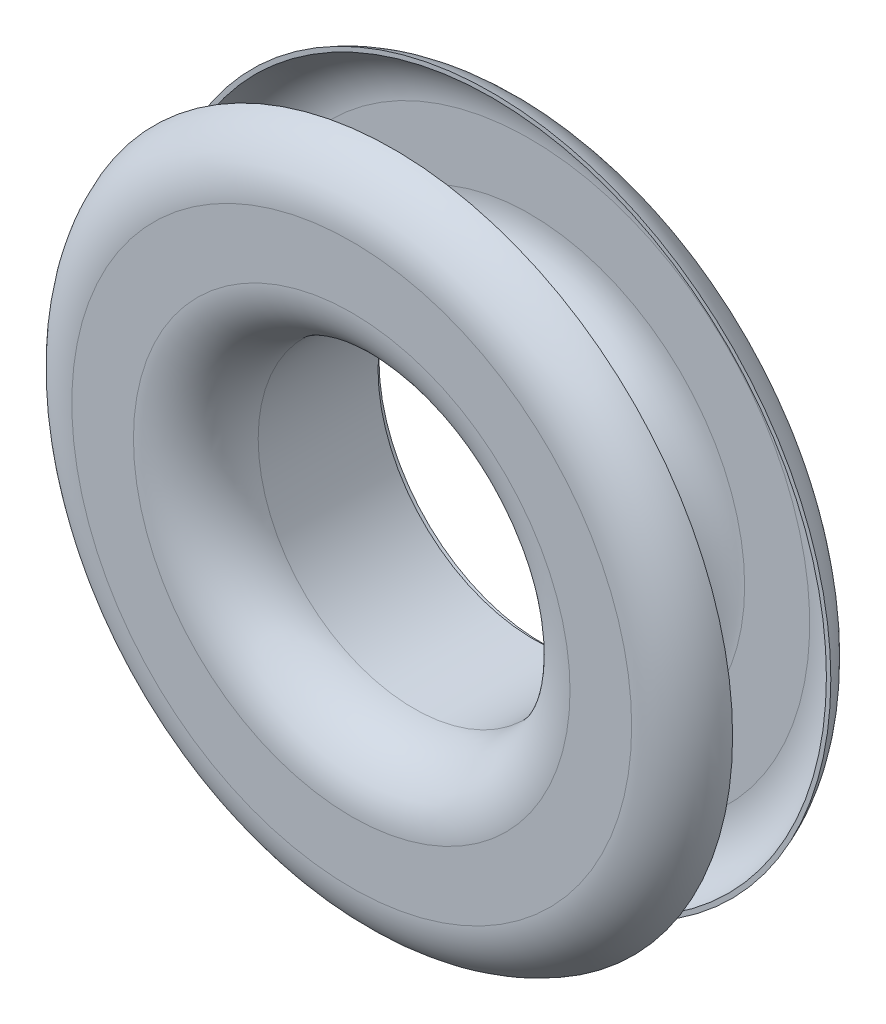
ISO-10303-21;
HEADER;
FILE_DESCRIPTION(('STEP AP214'),'2;1');
FILE_NAME('part.step','',(''),(''),'','','');
FILE_SCHEMA(('AUTOMOTIVE_DESIGN { 1 0 10303 214 1 1 1 1 }'));
ENDSEC;
DATA;
#1=APPLICATION_CONTEXT('core data for automotive mechanical design processes');
#2=APPLICATION_PROTOCOL_DEFINITION('international standard','automotive_design',2000,#1);
#3=PRODUCT_CONTEXT('',#1,'mechanical');
#4=PRODUCT('Part','Part','',(#3));
#5=PRODUCT_RELATED_PRODUCT_CATEGORY('part','',(#4));
#6=PRODUCT_DEFINITION_FORMATION('','',#4);
#7=PRODUCT_DEFINITION_CONTEXT('part definition',#1,'design');
#8=PRODUCT_DEFINITION('design','',#6,#7);
#9=PRODUCT_DEFINITION_SHAPE('','',#8);
#10=(LENGTH_UNIT() NAMED_UNIT(*) SI_UNIT(.MILLI.,.METRE.));
#11=(NAMED_UNIT(*) PLANE_ANGLE_UNIT() SI_UNIT($,.RADIAN.));
#12=(NAMED_UNIT(*) SI_UNIT($,.STERADIAN.) SOLID_ANGLE_UNIT());
#13=UNCERTAINTY_MEASURE_WITH_UNIT(LENGTH_MEASURE(1.E-05),#10,'distance_accuracy_value','');
#14=(GEOMETRIC_REPRESENTATION_CONTEXT(3) GLOBAL_UNCERTAINTY_ASSIGNED_CONTEXT((#13)) GLOBAL_UNIT_ASSIGNED_CONTEXT((#10,
#11,#12)) REPRESENTATION_CONTEXT('',''));
#15=CARTESIAN_POINT('',(0.,0.,0.));
#16=DIRECTION('',(0.,0.,1.));
#17=DIRECTION('',(1.,0.,0.));
#18=AXIS2_PLACEMENT_3D('',#15,#16,#17);
#19=CARTESIAN_POINT('',(0.,0.,13.529843654));
#20=DIRECTION('',(0.,0.,1.));
#21=DIRECTION('',(1.,0.,0.));
#22=AXIS2_PLACEMENT_3D('',#19,#20,#21);
#23=DEGENERATE_TOROIDAL_SURFACE('',#22,6.604,12.45314375,.T.);
#24=CARTESIAN_POINT('',(0.,0.,1.178299904));
#25=DIRECTION('',(0.,0.,1.));
#26=DIRECTION('',(1.,0.,0.));
#27=AXIS2_PLACEMENT_3D('',#24,#25,#26);
#28=CIRCLE('',#27,8.1915);
#29=CARTESIAN_POINT('',(8.1915,0.,1.178299904));
#30=VERTEX_POINT('',#29);
#31=EDGE_CURVE('E54',#30,#30,#28,.T.);
#32=ORIENTED_EDGE('',*,*,#31,.T.);
#33=EDGE_LOOP('',(#32));
#34=FACE_BOUND('',#33,.T.);
#35=CARTESIAN_POINT('',(0.,0.,1.178299904));
#36=DIRECTION('',(0.,0.,1.));
#37=DIRECTION('',(1.,0.,0.));
#38=AXIS2_PLACEMENT_3D('',#35,#36,#37);
#39=CIRCLE('',#38,5.0165);
#40=CARTESIAN_POINT('',(5.0165,0.,1.178299904));
#41=VERTEX_POINT('',#40);
#42=EDGE_CURVE('E12',#41,#41,#39,.T.);
#43=ORIENTED_EDGE('',*,*,#42,.F.);
#44=EDGE_LOOP('',(#43));
#45=FACE_BOUND('',#44,.T.);
#46=ADVANCED_FACE('F40',(#34,#45),#23,.F.);
#47=CARTESIAN_POINT('',(0.,0.,0.930931764070764));
#48=DIRECTION('',(0.,0.,1.));
#49=DIRECTION('',(1.,0.,0.));
#50=AXIS2_PLACEMENT_3D('',#47,#48,#49);
#51=CONICAL_SURFACE('',#50,4.98002945748271,0.146379742148267);
#52=ORIENTED_EDGE('',*,*,#42,.T.);
#53=EDGE_LOOP('',(#52));
#54=FACE_BOUND('',#53,.T.);
#55=CARTESIAN_POINT('',(0.,0.,0.930931764070764));
#56=DIRECTION('',(0.,0.,1.));
#57=DIRECTION('',(1.,0.,0.));
#58=AXIS2_PLACEMENT_3D('',#55,#56,#57);
#59=CIRCLE('',#58,4.98002945748271);
#60=CARTESIAN_POINT('',(4.98002945748271,0.,0.930931764070764));
#61=VERTEX_POINT('',#60);
#62=EDGE_CURVE('E46',#61,#61,#59,.T.);
#63=ORIENTED_EDGE('',*,*,#62,.F.);
#64=EDGE_LOOP('',(#63));
#65=FACE_BOUND('',#64,.T.);
#66=ADVANCED_FACE('F70',(#54,#65),#51,.F.);
#67=CARTESIAN_POINT('',(0.,0.,13.529843654));
#68=DIRECTION('',(0.,0.,1.));
#69=DIRECTION('',(1.,0.,0.));
#70=AXIS2_PLACEMENT_3D('',#67,#68,#69);
#71=DEGENERATE_TOROIDAL_SURFACE('',#70,6.604,12.70314375,.T.);
#72=ORIENTED_EDGE('',*,*,#62,.T.);
#73=EDGE_LOOP('',(#72));
#74=FACE_BOUND('',#73,.T.);
#75=CARTESIAN_POINT('',(0.,0.,0.930931764070764));
#76=DIRECTION('',(0.,0.,1.));
#77=DIRECTION('',(1.,0.,0.));
#78=AXIS2_PLACEMENT_3D('',#75,#76,#77);
#79=CIRCLE('',#78,8.22797054251729);
#80=CARTESIAN_POINT('',(8.22797054251729,0.,0.930931764070764));
#81=VERTEX_POINT('',#80);
#82=EDGE_CURVE('E50',#81,#81,#79,.T.);
#83=ORIENTED_EDGE('',*,*,#82,.F.);
#84=EDGE_LOOP('',(#83));
#85=FACE_BOUND('',#84,.T.);
#86=ADVANCED_FACE('F64',(#74,#85),#71,.T.);
#87=CARTESIAN_POINT('',(0.,0.,1.03875094289239));
#88=DIRECTION('',(0.,0.,1.));
#89=DIRECTION('',(1.,0.,0.));
#90=AXIS2_PLACEMENT_3D('',#87,#88,#89);
#91=TOROIDAL_SURFACE('',#90,8.10212873893572,0.16571401525047);
#92=ORIENTED_EDGE('',*,*,#82,.T.);
#93=EDGE_LOOP('',(#92));
#94=FACE_BOUND('',#93,.T.);
#95=ORIENTED_EDGE('',*,*,#31,.F.);
#96=EDGE_LOOP('',(#95));
#97=FACE_BOUND('',#96,.T.);
#98=ADVANCED_FACE('F62',(#94,#97),#91,.T.);
#99=CLOSED_SHELL('',(#46,#66,#86,#98));
#100=MANIFOLD_SOLID_BREP('B2',#99);
#101=CARTESIAN_POINT('',(0.,0.,1.178299904));
#102=DIRECTION('',(0.,0.,1.));
#103=DIRECTION('',(1.,0.,0.));
#104=AXIS2_PLACEMENT_3D('',#101,#102,#103);
#105=PLANE('',#104);
#106=CARTESIAN_POINT('',(0.,0.,1.178299904));
#107=DIRECTION('',(0.,0.,1.));
#108=DIRECTION('',(1.,0.,0.));
#109=AXIS2_PLACEMENT_3D('',#106,#107,#108);
#110=CIRCLE('',#109,8.55000903640146);
#111=CARTESIAN_POINT('',(8.55000903640146,0.,1.178299904));
#112=VERTEX_POINT('',#111);
#113=EDGE_CURVE('E115',#112,#112,#110,.F.);
#114=ORIENTED_EDGE('',*,*,#113,.T.);
#115=EDGE_LOOP('',(#114));
#116=FACE_BOUND('',#115,.T.);
#117=CARTESIAN_POINT('',(0.,0.,1.178299904));
#118=DIRECTION('',(0.,0.,1.));
#119=DIRECTION('',(1.,0.,0.));
#120=AXIS2_PLACEMENT_3D('',#117,#118,#119);
#121=CIRCLE('',#120,6.56299096359854);
#122=CARTESIAN_POINT('',(6.56299096359854,0.,1.178299904));
#123=VERTEX_POINT('',#122);
#124=EDGE_CURVE('E110',#123,#123,#121,.T.);
#125=ORIENTED_EDGE('',*,*,#124,.T.);
#126=EDGE_LOOP('',(#125));
#127=FACE_BOUND('',#126,.T.);
#128=ADVANCED_FACE('F102',(#116,#127),#105,.F.);
#129=CARTESIAN_POINT('',(0.,0.,2.460999904));
#130=DIRECTION('',(0.,0.,1.));
#131=DIRECTION('',(1.,0.,0.));
#132=AXIS2_PLACEMENT_3D('',#129,#130,#131);
#133=PLANE('',#132);
#134=CARTESIAN_POINT('',(0.,0.,2.460999904));
#135=DIRECTION('',(0.,0.,1.));
#136=DIRECTION('',(1.,0.,0.));
#137=AXIS2_PLACEMENT_3D('',#134,#135,#136);
#138=CIRCLE('',#137,10.2155500025743);
#139=CARTESIAN_POINT('',(10.2155500025743,0.,2.460999904));
#140=VERTEX_POINT('',#139);
#141=EDGE_CURVE('E127',#140,#140,#138,.T.);
#142=ORIENTED_EDGE('',*,*,#141,.F.);
#143=EDGE_LOOP('',(#142));
#144=FACE_BOUND('',#143,.T.);
#145=CARTESIAN_POINT('',(0.,0.,2.460999904));
#146=DIRECTION('',(0.,0.,1.));
#147=DIRECTION('',(1.,0.,0.));
#148=AXIS2_PLACEMENT_3D('',#145,#146,#147);
#149=CIRCLE('',#148,10.3505);
#150=CARTESIAN_POINT('',(10.3505,0.,2.460999904));
#151=VERTEX_POINT('',#150);
#152=EDGE_CURVE('E123',#151,#151,#149,.T.);
#153=ORIENTED_EDGE('',*,*,#152,.T.);
#154=EDGE_LOOP('',(#153));
#155=FACE_BOUND('',#154,.T.);
#156=ADVANCED_FACE('F143',(#144,#155),#133,.T.);
#157=CARTESIAN_POINT('',(0.,0.,3.083299904));
#158=DIRECTION('',(0.,0.,1.));
#159=DIRECTION('',(1.,0.,0.));
#160=AXIS2_PLACEMENT_3D('',#157,#158,#159);
#161=TOROIDAL_SURFACE('',#160,6.56299096359854,1.905);
#162=CARTESIAN_POINT('',(0.,0.,1.97091925893822));
#163=DIRECTION('',(0.,0.,1.));
#164=DIRECTION('',(1.,0.,0.));
#165=AXIS2_PLACEMENT_3D('',#162,#163,#164);
#166=CIRCLE('',#165,5.0165);
#167=CARTESIAN_POINT('',(5.0165,0.,1.97091925893822));
#168=VERTEX_POINT('',#167);
#169=EDGE_CURVE('E39',#168,#168,#166,.F.);
#170=ORIENTED_EDGE('',*,*,#169,.F.);
#171=EDGE_LOOP('',(#170));
#172=FACE_BOUND('',#171,.T.);
#173=ORIENTED_EDGE('',*,*,#124,.F.);
#174=EDGE_LOOP('',(#173));
#175=FACE_BOUND('',#174,.T.);
#176=ADVANCED_FACE('F140',(#172,#175),#161,.T.);
#177=CARTESIAN_POINT('',(0.,0.,3.083299904));
#178=DIRECTION('',(0.,0.,-1.));
#179=DIRECTION('',(-1.,0.,0.));
#180=AXIS2_PLACEMENT_3D('',#177,#178,#179);
#181=TOROIDAL_SURFACE('',#180,8.55000903640146,1.905);
#182=ORIENTED_EDGE('',*,*,#113,.F.);
#183=EDGE_LOOP('',(#182));
#184=FACE_BOUND('',#183,.T.);
#185=ORIENTED_EDGE('',*,*,#152,.F.);
#186=EDGE_LOOP('',(#185));
#187=FACE_BOUND('',#186,.T.);
#188=ADVANCED_FACE('F104',(#184,#187),#181,.T.);
#189=CARTESIAN_POINT('',(0.,0.,1.305299904));
#190=DIRECTION('',(0.,0.,1.));
#191=DIRECTION('',(1.,0.,0.));
#192=AXIS2_PLACEMENT_3D('',#189,#190,#191);
#193=PLANE('',#192);
#194=CARTESIAN_POINT('',(0.,0.,1.305299904));
#195=DIRECTION('',(0.,0.,1.));
#196=DIRECTION('',(1.,0.,0.));
#197=AXIS2_PLACEMENT_3D('',#194,#195,#196);
#198=CIRCLE('',#197,6.56299096359854);
#199=CARTESIAN_POINT('',(6.56299096359854,0.,1.305299904));
#200=VERTEX_POINT('',#199);
#201=EDGE_CURVE('E120',#200,#200,#198,.T.);
#202=ORIENTED_EDGE('',*,*,#201,.F.);
#203=EDGE_LOOP('',(#202));
#204=FACE_BOUND('',#203,.T.);
#205=CARTESIAN_POINT('',(0.,0.,1.305299904));
#206=DIRECTION('',(0.,0.,-1.));
#207=DIRECTION('',(-1.,0.,0.));
#208=AXIS2_PLACEMENT_3D('',#205,#206,#207);
#209=CIRCLE('',#208,8.55000903640146);
#210=CARTESIAN_POINT('',(-8.55000903640146,0.,1.305299904));
#211=VERTEX_POINT('',#210);
#212=EDGE_CURVE('E124',#211,#211,#209,.T.);
#213=ORIENTED_EDGE('',*,*,#212,.F.);
#214=EDGE_LOOP('',(#213));
#215=FACE_BOUND('',#214,.T.);
#216=ADVANCED_FACE('F139',(#204,#215),#193,.T.);
#217=CARTESIAN_POINT('',(0.,0.,3.083299904));
#218=DIRECTION('',(0.,0.,1.));
#219=DIRECTION('',(1.,0.,0.));
#220=AXIS2_PLACEMENT_3D('',#217,#218,#219);
#221=TOROIDAL_SURFACE('',#220,6.56299096359854,1.778);
#222=CARTESIAN_POINT('',(0.,0.,2.20600309019748));
#223=DIRECTION('',(0.,0.,1.));
#224=DIRECTION('',(1.,0.,0.));
#225=AXIS2_PLACEMENT_3D('',#222,#223,#224);
#226=CIRCLE('',#225,5.0165);
#227=CARTESIAN_POINT('',(5.0165,0.,2.20600309019748));
#228=VERTEX_POINT('',#227);
#229=EDGE_CURVE('E106',#228,#228,#226,.F.);
#230=ORIENTED_EDGE('',*,*,#229,.T.);
#231=EDGE_LOOP('',(#230));
#232=FACE_BOUND('',#231,.T.);
#233=ORIENTED_EDGE('',*,*,#201,.T.);
#234=EDGE_LOOP('',(#233));
#235=FACE_BOUND('',#234,.T.);
#236=ADVANCED_FACE('F159',(#232,#235),#221,.F.);
#237=CARTESIAN_POINT('',(0.,0.,3.083299904));
#238=DIRECTION('',(0.,0.,-1.));
#239=DIRECTION('',(-1.,0.,0.));
#240=AXIS2_PLACEMENT_3D('',#237,#238,#239);
#241=TOROIDAL_SURFACE('',#240,8.55000903640146,1.778);
#242=ORIENTED_EDGE('',*,*,#212,.T.);
#243=EDGE_LOOP('',(#242));
#244=FACE_BOUND('',#243,.T.);
#245=ORIENTED_EDGE('',*,*,#141,.T.);
#246=EDGE_LOOP('',(#245));
#247=FACE_BOUND('',#246,.T.);
#248=ADVANCED_FACE('F155',(#244,#247),#241,.F.);
#249=CARTESIAN_POINT('',(0.,0.,6.7437));
#250=DIRECTION('',(0.,0.,-1.));
#251=DIRECTION('',(-1.,0.,0.));
#252=AXIS2_PLACEMENT_3D('',#249,#250,#251);
#253=CYLINDRICAL_SURFACE('',#252,4.7625);
#254=CARTESIAN_POINT('',(0.,0.,4.8387));
#255=DIRECTION('',(0.,0.,1.));
#256=DIRECTION('',(1.,0.,0.));
#257=AXIS2_PLACEMENT_3D('',#254,#255,#256);
#258=CIRCLE('',#257,4.7625);
#259=CARTESIAN_POINT('',(4.7625,0.,4.8387));
#260=VERTEX_POINT('',#259);
#261=EDGE_CURVE('E239',#260,#260,#258,.T.);
#262=ORIENTED_EDGE('',*,*,#261,.T.);
#263=EDGE_LOOP('',(#262));
#264=FACE_BOUND('',#263,.T.);
#265=CARTESIAN_POINT('',(0.,0.,1.178299904));
#266=DIRECTION('',(0.,0.,-1.));
#267=DIRECTION('',(-1.,0.,0.));
#268=AXIS2_PLACEMENT_3D('',#265,#266,#267);
#269=CIRCLE('',#268,4.7625);
#270=CARTESIAN_POINT('',(-4.7625,0.,1.178299904));
#271=VERTEX_POINT('',#270);
#272=EDGE_CURVE('E214',#271,#271,#269,.T.);
#273=ORIENTED_EDGE('',*,*,#272,.T.);
#274=EDGE_LOOP('',(#273));
#275=FACE_BOUND('',#274,.T.);
#276=ADVANCED_FACE('F158',(#264,#275),#253,.F.);
#277=CARTESIAN_POINT('',(0.,0.,0.));
#278=DIRECTION('',(0.,0.,1.));
#279=DIRECTION('',(1.,0.,0.));
#280=AXIS2_PLACEMENT_3D('',#277,#278,#279);
#281=CYLINDRICAL_SURFACE('',#280,5.0165);
#282=CARTESIAN_POINT('',(0.,0.,5.461));
#283=DIRECTION('',(0.,0.,1.));
#284=DIRECTION('',(1.,0.,0.));
#285=AXIS2_PLACEMENT_3D('',#282,#283,#284);
#286=CIRCLE('',#285,5.0165);
#287=CARTESIAN_POINT('',(5.0165,0.,5.461));
#288=VERTEX_POINT('',#287);
#289=EDGE_CURVE('E233',#288,#288,#286,.T.);
#290=ORIENTED_EDGE('',*,*,#289,.F.);
#291=EDGE_LOOP('',(#290));
#292=FACE_BOUND('',#291,.T.);
#293=ORIENTED_EDGE('',*,*,#229,.F.);
#294=EDGE_LOOP('',(#293));
#295=FACE_BOUND('',#294,.T.);
#296=ADVANCED_FACE('F187',(#292,#295),#281,.T.);
#297=ORIENTED_EDGE('',*,*,#169,.T.);
#298=EDGE_LOOP('',(#297));
#299=FACE_BOUND('',#298,.T.);
#300=CARTESIAN_POINT('',(0.,0.,1.178299904));
#301=DIRECTION('',(0.,0.,-1.));
#302=DIRECTION('',(-1.,0.,0.));
#303=AXIS2_PLACEMENT_3D('',#300,#301,#302);
#304=CIRCLE('',#303,5.0165);
#305=CARTESIAN_POINT('',(-5.0165,0.,1.178299904));
#306=VERTEX_POINT('',#305);
#307=EDGE_CURVE('E118',#306,#306,#304,.F.);
#308=ORIENTED_EDGE('',*,*,#307,.T.);
#309=EDGE_LOOP('',(#308));
#310=FACE_BOUND('',#309,.T.);
#311=ADVANCED_FACE('F183',(#299,#310),#281,.T.);
#312=CARTESIAN_POINT('',(0.,0.,6.7437));
#313=DIRECTION('',(0.,0.,1.));
#314=DIRECTION('',(1.,0.,0.));
#315=AXIS2_PLACEMENT_3D('',#312,#313,#314);
#316=PLANE('',#315);
#317=CARTESIAN_POINT('',(0.,0.,6.7437));
#318=DIRECTION('',(0.,0.,1.));
#319=DIRECTION('',(1.,0.,0.));
#320=AXIS2_PLACEMENT_3D('',#317,#318,#319);
#321=CIRCLE('',#320,6.6675);
#322=CARTESIAN_POINT('',(6.6675,0.,6.7437));
#323=VERTEX_POINT('',#322);
#324=EDGE_CURVE('E244',#323,#323,#321,.F.);
#325=ORIENTED_EDGE('',*,*,#324,.T.);
#326=EDGE_LOOP('',(#325));
#327=FACE_BOUND('',#326,.T.);
#328=CARTESIAN_POINT('',(0.,0.,6.7437));
#329=DIRECTION('',(0.,0.,1.));
#330=DIRECTION('',(1.,0.,0.));
#331=AXIS2_PLACEMENT_3D('',#328,#329,#330);
#332=CIRCLE('',#331,8.55000903640146);
#333=CARTESIAN_POINT('',(8.55000903640146,0.,6.7437));
#334=VERTEX_POINT('',#333);
#335=EDGE_CURVE('E242',#334,#334,#332,.T.);
#336=ORIENTED_EDGE('',*,*,#335,.T.);
#337=EDGE_LOOP('',(#336));
#338=FACE_BOUND('',#337,.T.);
#339=ADVANCED_FACE('F179',(#327,#338),#316,.T.);
#340=CARTESIAN_POINT('',(0.,0.,5.461));
#341=DIRECTION('',(0.,0.,1.));
#342=DIRECTION('',(1.,0.,0.));
#343=AXIS2_PLACEMENT_3D('',#340,#341,#342);
#344=PLANE('',#343);
#345=CARTESIAN_POINT('',(0.,0.,5.461));
#346=DIRECTION('',(0.,0.,1.));
#347=DIRECTION('',(1.,0.,0.));
#348=AXIS2_PLACEMENT_3D('',#345,#346,#347);
#349=CIRCLE('',#348,10.2155500025743);
#350=CARTESIAN_POINT('',(10.2155500025743,0.,5.461));
#351=VERTEX_POINT('',#350);
#352=EDGE_CURVE('E218',#351,#351,#349,.T.);
#353=ORIENTED_EDGE('',*,*,#352,.T.);
#354=EDGE_LOOP('',(#353));
#355=FACE_BOUND('',#354,.T.);
#356=CARTESIAN_POINT('',(0.,0.,5.461));
#357=DIRECTION('',(0.,0.,1.));
#358=DIRECTION('',(1.,0.,0.));
#359=AXIS2_PLACEMENT_3D('',#356,#357,#358);
#360=CIRCLE('',#359,10.3505);
#361=CARTESIAN_POINT('',(10.3505,0.,5.461));
#362=VERTEX_POINT('',#361);
#363=EDGE_CURVE('E236',#362,#362,#360,.T.);
#364=ORIENTED_EDGE('',*,*,#363,.F.);
#365=EDGE_LOOP('',(#364));
#366=FACE_BOUND('',#365,.T.);
#367=ADVANCED_FACE('F175',(#355,#366),#344,.F.);
#368=CARTESIAN_POINT('',(0.,0.,4.8387));
#369=DIRECTION('',(0.,0.,1.));
#370=DIRECTION('',(1.,0.,0.));
#371=AXIS2_PLACEMENT_3D('',#368,#369,#370);
#372=TOROIDAL_SURFACE('',#371,6.6675,1.905);
#373=ORIENTED_EDGE('',*,*,#324,.F.);
#374=EDGE_LOOP('',(#373));
#375=FACE_BOUND('',#374,.T.);
#376=ORIENTED_EDGE('',*,*,#261,.F.);
#377=EDGE_LOOP('',(#376));
#378=FACE_BOUND('',#377,.T.);
#379=ADVANCED_FACE('F171',(#375,#378),#372,.T.);
#380=CARTESIAN_POINT('',(0.,0.,4.8387));
#381=DIRECTION('',(0.,0.,-1.));
#382=DIRECTION('',(-1.,0.,0.));
#383=AXIS2_PLACEMENT_3D('',#380,#381,#382);
#384=TOROIDAL_SURFACE('',#383,8.55000903640146,1.905);
#385=ORIENTED_EDGE('',*,*,#363,.T.);
#386=EDGE_LOOP('',(#385));
#387=FACE_BOUND('',#386,.T.);
#388=ORIENTED_EDGE('',*,*,#335,.F.);
#389=EDGE_LOOP('',(#388));
#390=FACE_BOUND('',#389,.T.);
#391=ADVANCED_FACE('F167',(#387,#390),#384,.T.);
#392=CARTESIAN_POINT('',(0.,0.,5.461));
#393=DIRECTION('',(0.,0.,1.));
#394=DIRECTION('',(1.,0.,0.));
#395=AXIS2_PLACEMENT_3D('',#392,#393,#394);
#396=PLANE('',#395);
#397=CARTESIAN_POINT('',(0.,0.,5.461));
#398=DIRECTION('',(0.,0.,-1.));
#399=DIRECTION('',(-1.,0.,0.));
#400=AXIS2_PLACEMENT_3D('',#397,#398,#399);
#401=CIRCLE('',#400,5.00195903382715);
#402=CARTESIAN_POINT('',(-5.00195903382715,0.,5.461));
#403=VERTEX_POINT('',#402);
#404=EDGE_CURVE('E228',#403,#403,#401,.F.);
#405=ORIENTED_EDGE('',*,*,#404,.F.);
#406=EDGE_LOOP('',(#405));
#407=FACE_BOUND('',#406,.T.);
#408=ORIENTED_EDGE('',*,*,#289,.T.);
#409=EDGE_LOOP('',(#408));
#410=FACE_BOUND('',#409,.T.);
#411=ADVANCED_FACE('F170',(#407,#410),#396,.T.);
#412=CARTESIAN_POINT('',(0.,0.,4.8387));
#413=DIRECTION('',(0.,0.,-1.));
#414=DIRECTION('',(-1.,0.,0.));
#415=AXIS2_PLACEMENT_3D('',#412,#413,#414);
#416=TOROIDAL_SURFACE('',#415,8.55000903640146,1.778);
#417=ORIENTED_EDGE('',*,*,#352,.F.);
#418=EDGE_LOOP('',(#417));
#419=FACE_BOUND('',#418,.T.);
#420=CARTESIAN_POINT('',(0.,0.,6.6167));
#421=DIRECTION('',(0.,0.,-1.));
#422=DIRECTION('',(-1.,0.,0.));
#423=AXIS2_PLACEMENT_3D('',#420,#421,#422);
#424=CIRCLE('',#423,8.55000903640146);
#425=CARTESIAN_POINT('',(-8.55000903640146,0.,6.6167));
#426=VERTEX_POINT('',#425);
#427=EDGE_CURVE('E222',#426,#426,#424,.F.);
#428=ORIENTED_EDGE('',*,*,#427,.T.);
#429=EDGE_LOOP('',(#428));
#430=FACE_BOUND('',#429,.T.);
#431=ADVANCED_FACE('F191',(#419,#430),#416,.F.);
#432=CARTESIAN_POINT('',(0.,0.,4.8387));
#433=DIRECTION('',(0.,0.,1.));
#434=DIRECTION('',(1.,0.,0.));
#435=AXIS2_PLACEMENT_3D('',#432,#433,#434);
#436=TOROIDAL_SURFACE('',#435,6.6675,1.778);
#437=ORIENTED_EDGE('',*,*,#404,.T.);
#438=EDGE_LOOP('',(#437));
#439=FACE_BOUND('',#438,.T.);
#440=CARTESIAN_POINT('',(0.,0.,6.6167));
#441=DIRECTION('',(0.,0.,1.));
#442=DIRECTION('',(1.,0.,0.));
#443=AXIS2_PLACEMENT_3D('',#440,#441,#442);
#444=CIRCLE('',#443,6.6675);
#445=CARTESIAN_POINT('',(6.6675,0.,6.6167));
#446=VERTEX_POINT('',#445);
#447=EDGE_CURVE('E225',#446,#446,#444,.F.);
#448=ORIENTED_EDGE('',*,*,#447,.T.);
#449=EDGE_LOOP('',(#448));
#450=FACE_BOUND('',#449,.T.);
#451=ADVANCED_FACE('F194',(#439,#450),#436,.F.);
#452=CARTESIAN_POINT('',(0.,0.,6.6167));
#453=DIRECTION('',(0.,0.,1.));
#454=DIRECTION('',(1.,0.,0.));
#455=AXIS2_PLACEMENT_3D('',#452,#453,#454);
#456=PLANE('',#455);
#457=ORIENTED_EDGE('',*,*,#447,.F.);
#458=EDGE_LOOP('',(#457));
#459=FACE_BOUND('',#458,.T.);
#460=ORIENTED_EDGE('',*,*,#427,.F.);
#461=EDGE_LOOP('',(#460));
#462=FACE_BOUND('',#461,.T.);
#463=ADVANCED_FACE('F198',(#459,#462),#456,.F.);
#464=CARTESIAN_POINT('',(0.,0.,1.178299904));
#465=DIRECTION('',(0.,0.,-1.));
#466=DIRECTION('',(-1.,0.,0.));
#467=AXIS2_PLACEMENT_3D('',#464,#465,#466);
#468=PLANE('',#467);
#469=ORIENTED_EDGE('',*,*,#272,.F.);
#470=EDGE_LOOP('',(#469));
#471=FACE_BOUND('',#470,.T.);
#472=ORIENTED_EDGE('',*,*,#307,.F.);
#473=EDGE_LOOP('',(#472));
#474=FACE_BOUND('',#473,.T.);
#475=ADVANCED_FACE('F202',(#471,#474),#468,.T.);
#476=CLOSED_SHELL('',(#128,#156,#176,#188,#216,#236,#248,#276,#296,#311,#339,#367,#379,#391,
#411,#431,#451,#463,#475));
#477=MANIFOLD_SOLID_BREP('B7',#476);
#478=ADVANCED_BREP_SHAPE_REPRESENTATION('',(#18,#100,#477),#14);
#479=SHAPE_DEFINITION_REPRESENTATION(#9,#478);
ENDSEC;
END-ISO-10303-21;
